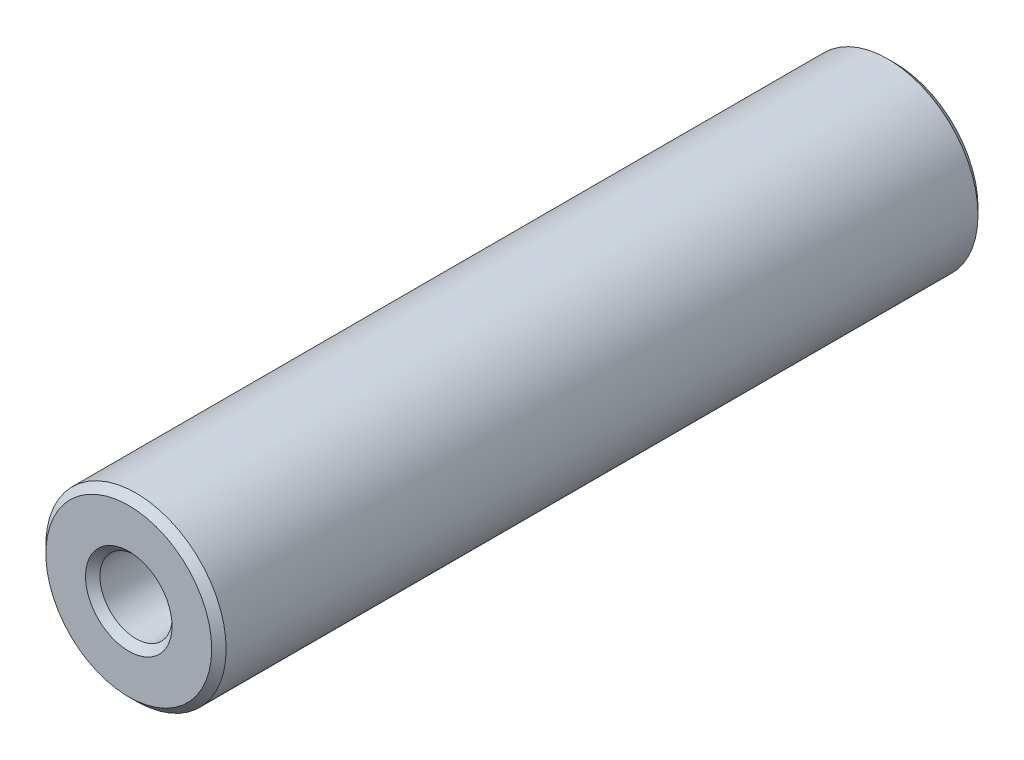
ISO-10303-21;
HEADER;
FILE_DESCRIPTION(('STEP AP214'),'2;1');
FILE_NAME('part.step','',(''),(''),'','','');
FILE_SCHEMA(('AUTOMOTIVE_DESIGN { 1 0 10303 214 1 1 1 1 }'));
ENDSEC;
DATA;
#1=APPLICATION_CONTEXT('core data for automotive mechanical design processes');
#2=APPLICATION_PROTOCOL_DEFINITION('international standard','automotive_design',2000,#1);
#3=PRODUCT_CONTEXT('',#1,'mechanical');
#4=PRODUCT('Part','Part','',(#3));
#5=PRODUCT_RELATED_PRODUCT_CATEGORY('part','',(#4));
#6=PRODUCT_DEFINITION_FORMATION('','',#4);
#7=PRODUCT_DEFINITION_CONTEXT('part definition',#1,'design');
#8=PRODUCT_DEFINITION('design','',#6,#7);
#9=PRODUCT_DEFINITION_SHAPE('','',#8);
#10=(LENGTH_UNIT() NAMED_UNIT(*) SI_UNIT(.MILLI.,.METRE.));
#11=(NAMED_UNIT(*) PLANE_ANGLE_UNIT() SI_UNIT($,.RADIAN.));
#12=(NAMED_UNIT(*) SI_UNIT($,.STERADIAN.) SOLID_ANGLE_UNIT());
#13=UNCERTAINTY_MEASURE_WITH_UNIT(LENGTH_MEASURE(1.E-05),#10,'distance_accuracy_value','');
#14=(GEOMETRIC_REPRESENTATION_CONTEXT(3) GLOBAL_UNCERTAINTY_ASSIGNED_CONTEXT((#13)) GLOBAL_UNIT_ASSIGNED_CONTEXT((#10,
#11,#12)) REPRESENTATION_CONTEXT('',''));
#15=CARTESIAN_POINT('',(0.,0.,0.));
#16=DIRECTION('',(0.,0.,1.));
#17=DIRECTION('',(1.,0.,0.));
#18=AXIS2_PLACEMENT_3D('',#15,#16,#17);
#19=CARTESIAN_POINT('',(0.,0.,53.975));
#20=DIRECTION('',(0.,0.,1.));
#21=DIRECTION('',(1.,0.,0.));
#22=AXIS2_PLACEMENT_3D('',#19,#20,#21);
#23=PLANE('',#22);
#24=CARTESIAN_POINT('',(0.,0.,53.975));
#25=DIRECTION('',(0.,0.,1.));
#26=DIRECTION('',(1.,0.,0.));
#27=AXIS2_PLACEMENT_3D('',#24,#25,#26);
#28=CIRCLE('',#27,3.048);
#29=CARTESIAN_POINT('',(3.048,0.,53.975));
#30=VERTEX_POINT('',#29);
#31=EDGE_CURVE('E10',#30,#30,#28,.F.);
#32=ORIENTED_EDGE('',*,*,#31,.T.);
#33=EDGE_LOOP('',(#32));
#34=FACE_BOUND('',#33,.T.);
#35=CARTESIAN_POINT('',(0.,0.,53.975));
#36=DIRECTION('',(0.,0.,1.));
#37=DIRECTION('',(1.,0.,0.));
#38=AXIS2_PLACEMENT_3D('',#35,#36,#37);
#39=CIRCLE('',#38,5.84199999999999);
#40=CARTESIAN_POINT('',(5.84199999999999,0.,53.975));
#41=VERTEX_POINT('',#40);
#42=EDGE_CURVE('E38',#41,#41,#39,.T.);
#43=ORIENTED_EDGE('',*,*,#42,.T.);
#44=EDGE_LOOP('',(#43));
#45=FACE_BOUND('',#44,.T.);
#46=ADVANCED_FACE('F31',(#34,#45),#23,.T.);
#47=CARTESIAN_POINT('',(0.,0.,0.));
#48=DIRECTION('',(0.,0.,1.));
#49=DIRECTION('',(1.,0.,0.));
#50=AXIS2_PLACEMENT_3D('',#47,#48,#49);
#51=PLANE('',#50);
#52=CARTESIAN_POINT('',(0.,0.,0.));
#53=DIRECTION('',(0.,0.,1.));
#54=DIRECTION('',(1.,0.,0.));
#55=AXIS2_PLACEMENT_3D('',#52,#53,#54);
#56=CIRCLE('',#55,3.048);
#57=CARTESIAN_POINT('',(3.048,0.,0.));
#58=VERTEX_POINT('',#57);
#59=EDGE_CURVE('E57',#58,#58,#56,.T.);
#60=ORIENTED_EDGE('',*,*,#59,.T.);
#61=EDGE_LOOP('',(#60));
#62=FACE_BOUND('',#61,.T.);
#63=CARTESIAN_POINT('',(0.,0.,0.));
#64=DIRECTION('',(0.,0.,1.));
#65=DIRECTION('',(1.,0.,0.));
#66=AXIS2_PLACEMENT_3D('',#63,#64,#65);
#67=CIRCLE('',#66,5.842);
#68=CARTESIAN_POINT('',(5.842,0.,0.));
#69=VERTEX_POINT('',#68);
#70=EDGE_CURVE('E60',#69,#69,#67,.F.);
#71=ORIENTED_EDGE('',*,*,#70,.T.);
#72=EDGE_LOOP('',(#71));
#73=FACE_BOUND('',#72,.T.);
#74=ADVANCED_FACE('F64',(#62,#73),#51,.F.);
#75=CARTESIAN_POINT('',(0.,0.,53.975));
#76=DIRECTION('',(0.,0.,-1.));
#77=DIRECTION('',(-1.,0.,0.));
#78=AXIS2_PLACEMENT_3D('',#75,#76,#77);
#79=CYLINDRICAL_SURFACE('',#78,6.35);
#80=CARTESIAN_POINT('',(0.,0.,0.507999999999995));
#81=DIRECTION('',(0.,0.,1.));
#82=DIRECTION('',(1.,0.,0.));
#83=AXIS2_PLACEMENT_3D('',#80,#81,#82);
#84=CIRCLE('',#83,6.35);
#85=CARTESIAN_POINT('',(6.35,0.,0.507999999999995));
#86=VERTEX_POINT('',#85);
#87=EDGE_CURVE('E42',#86,#86,#84,.T.);
#88=ORIENTED_EDGE('',*,*,#87,.T.);
#89=EDGE_LOOP('',(#88));
#90=FACE_BOUND('',#89,.T.);
#91=CARTESIAN_POINT('',(0.,0.,53.467));
#92=DIRECTION('',(0.,0.,1.));
#93=DIRECTION('',(1.,0.,0.));
#94=AXIS2_PLACEMENT_3D('',#91,#92,#93);
#95=CIRCLE('',#94,6.35);
#96=CARTESIAN_POINT('',(6.35,0.,53.467));
#97=VERTEX_POINT('',#96);
#98=EDGE_CURVE('E46',#97,#97,#95,.F.);
#99=ORIENTED_EDGE('',*,*,#98,.T.);
#100=EDGE_LOOP('',(#99));
#101=FACE_BOUND('',#100,.T.);
#102=ADVANCED_FACE('F74',(#90,#101),#79,.T.);
#103=CARTESIAN_POINT('',(0.,0.,53.975));
#104=DIRECTION('',(0.,0.,-1.));
#105=DIRECTION('',(-1.,0.,0.));
#106=AXIS2_PLACEMENT_3D('',#103,#104,#105);
#107=CYLINDRICAL_SURFACE('',#106,2.54);
#108=CARTESIAN_POINT('',(0.,0.,0.507999999999995));
#109=DIRECTION('',(0.,0.,1.));
#110=DIRECTION('',(1.,0.,0.));
#111=AXIS2_PLACEMENT_3D('',#108,#109,#110);
#112=CIRCLE('',#111,2.54);
#113=CARTESIAN_POINT('',(2.54,0.,0.507999999999995));
#114=VERTEX_POINT('',#113);
#115=EDGE_CURVE('E51',#114,#114,#112,.F.);
#116=ORIENTED_EDGE('',*,*,#115,.T.);
#117=EDGE_LOOP('',(#116));
#118=FACE_BOUND('',#117,.T.);
#119=CARTESIAN_POINT('',(0.,0.,53.467));
#120=DIRECTION('',(0.,0.,1.));
#121=DIRECTION('',(1.,0.,0.));
#122=AXIS2_PLACEMENT_3D('',#119,#120,#121);
#123=CIRCLE('',#122,2.54);
#124=CARTESIAN_POINT('',(2.54,0.,53.467));
#125=VERTEX_POINT('',#124);
#126=EDGE_CURVE('E54',#125,#125,#123,.T.);
#127=ORIENTED_EDGE('',*,*,#126,.T.);
#128=EDGE_LOOP('',(#127));
#129=FACE_BOUND('',#128,.T.);
#130=ADVANCED_FACE('F77',(#118,#129),#107,.F.);
#131=CARTESIAN_POINT('',(0.,0.,0.));
#132=DIRECTION('',(0.,0.,-1.));
#133=DIRECTION('',(-1.,0.,0.));
#134=AXIS2_PLACEMENT_3D('',#131,#132,#133);
#135=CONICAL_SURFACE('',#134,3.048,0.785398163397449);
#136=ORIENTED_EDGE('',*,*,#115,.F.);
#137=EDGE_LOOP('',(#136));
#138=FACE_BOUND('',#137,.T.);
#139=ORIENTED_EDGE('',*,*,#59,.F.);
#140=EDGE_LOOP('',(#139));
#141=FACE_BOUND('',#140,.T.);
#142=ADVANCED_FACE('F70',(#138,#141),#135,.F.);
#143=CARTESIAN_POINT('',(0.,0.,0.507999999999995));
#144=DIRECTION('',(0.,0.,1.));
#145=DIRECTION('',(1.,0.,0.));
#146=AXIS2_PLACEMENT_3D('',#143,#144,#145);
#147=CONICAL_SURFACE('',#146,6.35,0.785398163397453);
#148=ORIENTED_EDGE('',*,*,#70,.F.);
#149=EDGE_LOOP('',(#148));
#150=FACE_BOUND('',#149,.T.);
#151=ORIENTED_EDGE('',*,*,#87,.F.);
#152=EDGE_LOOP('',(#151));
#153=FACE_BOUND('',#152,.T.);
#154=ADVANCED_FACE('F66',(#150,#153),#147,.T.);
#155=CARTESIAN_POINT('',(0.,0.,53.467));
#156=DIRECTION('',(0.,0.,1.));
#157=DIRECTION('',(1.,0.,0.));
#158=AXIS2_PLACEMENT_3D('',#155,#156,#157);
#159=CONICAL_SURFACE('',#158,2.54,0.785398163397442);
#160=ORIENTED_EDGE('',*,*,#31,.F.);
#161=EDGE_LOOP('',(#160));
#162=FACE_BOUND('',#161,.T.);
#163=ORIENTED_EDGE('',*,*,#126,.F.);
#164=EDGE_LOOP('',(#163));
#165=FACE_BOUND('',#164,.T.);
#166=ADVANCED_FACE('F69',(#162,#165),#159,.F.);
#167=CARTESIAN_POINT('',(0.,0.,53.975));
#168=DIRECTION('',(0.,0.,-1.));
#169=DIRECTION('',(-1.,0.,0.));
#170=AXIS2_PLACEMENT_3D('',#167,#168,#169);
#171=CONICAL_SURFACE('',#170,5.84199999999999,0.785398163397447);
#172=ORIENTED_EDGE('',*,*,#98,.F.);
#173=EDGE_LOOP('',(#172));
#174=FACE_BOUND('',#173,.T.);
#175=ORIENTED_EDGE('',*,*,#42,.F.);
#176=EDGE_LOOP('',(#175));
#177=FACE_BOUND('',#176,.T.);
#178=ADVANCED_FACE('F33',(#174,#177),#171,.T.);
#179=CLOSED_SHELL('',(#46,#74,#102,#130,#142,#154,#166,#178));
#180=MANIFOLD_SOLID_BREP('B2',#179);
#181=ADVANCED_BREP_SHAPE_REPRESENTATION('',(#18,#180),#14);
#182=SHAPE_DEFINITION_REPRESENTATION(#9,#181);
ENDSEC;
END-ISO-10303-21;
